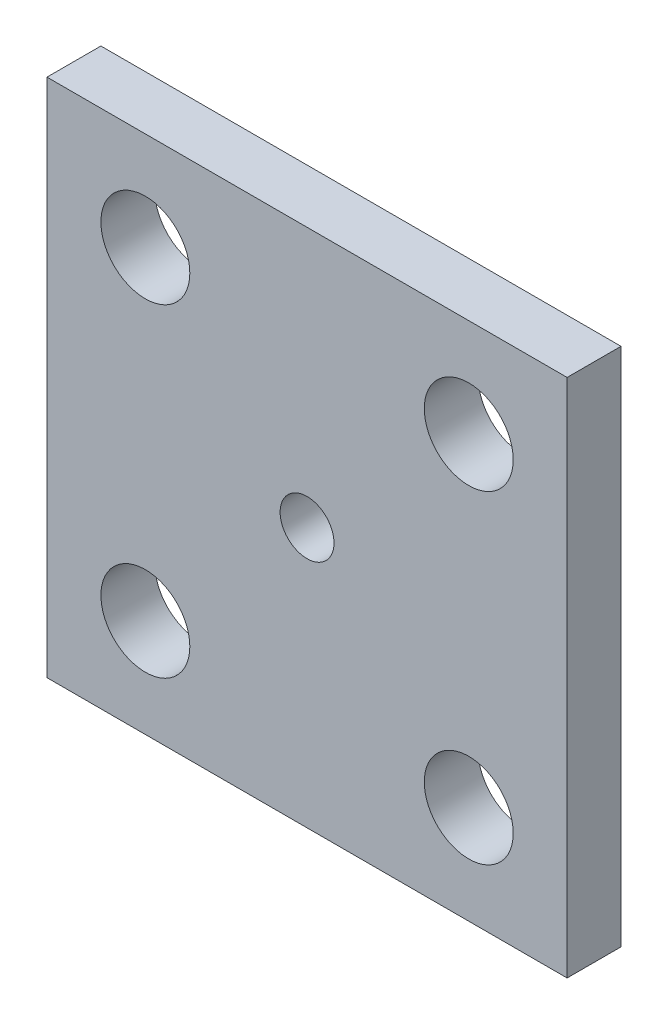
ISO-10303-21;
HEADER;
FILE_DESCRIPTION(('STEP AP214'),'2;1');
FILE_NAME('part.step','',(''),(''),'','','');
FILE_SCHEMA(('AUTOMOTIVE_DESIGN { 1 0 10303 214 1 1 1 1 }'));
ENDSEC;
DATA;
#1=APPLICATION_CONTEXT('core data for automotive mechanical design processes');
#2=APPLICATION_PROTOCOL_DEFINITION('international standard','automotive_design',2000,#1);
#3=PRODUCT_CONTEXT('',#1,'mechanical');
#4=PRODUCT('Part','Part','',(#3));
#5=PRODUCT_RELATED_PRODUCT_CATEGORY('part','',(#4));
#6=PRODUCT_DEFINITION_FORMATION('','',#4);
#7=PRODUCT_DEFINITION_CONTEXT('part definition',#1,'design');
#8=PRODUCT_DEFINITION('design','',#6,#7);
#9=PRODUCT_DEFINITION_SHAPE('','',#8);
#10=(LENGTH_UNIT() NAMED_UNIT(*) SI_UNIT(.MILLI.,.METRE.));
#11=(NAMED_UNIT(*) PLANE_ANGLE_UNIT() SI_UNIT($,.RADIAN.));
#12=(NAMED_UNIT(*) SI_UNIT($,.STERADIAN.) SOLID_ANGLE_UNIT());
#13=UNCERTAINTY_MEASURE_WITH_UNIT(LENGTH_MEASURE(1.E-05),#10,'distance_accuracy_value','');
#14=(GEOMETRIC_REPRESENTATION_CONTEXT(3) GLOBAL_UNCERTAINTY_ASSIGNED_CONTEXT((#13)) GLOBAL_UNIT_ASSIGNED_CONTEXT((#10,
#11,#12)) REPRESENTATION_CONTEXT('',''));
#15=CARTESIAN_POINT('',(0.,0.,0.));
#16=DIRECTION('',(0.,0.,1.));
#17=DIRECTION('',(1.,0.,0.));
#18=AXIS2_PLACEMENT_3D('',#15,#16,#17);
#19=CARTESIAN_POINT('',(0.,0.,5.));
#20=DIRECTION('',(0.,1.,0.));
#21=DIRECTION('',(0.,0.,1.));
#22=AXIS2_PLACEMENT_3D('',#19,#20,#21);
#23=PLANE('',#22);
#24=DIRECTION('',(1.,0.,0.));
#25=VECTOR('',#24,1.);
#26=CARTESIAN_POINT('',(0.,0.,0.));
#27=LINE('',#26,#25);
#28=CARTESIAN_POINT('',(0.,0.,0.));
#29=VERTEX_POINT('',#28);
#30=CARTESIAN_POINT('',(48.25,0.,0.));
#31=VERTEX_POINT('',#30);
#32=EDGE_CURVE('E117',#29,#31,#27,.T.);
#33=ORIENTED_EDGE('',*,*,#32,.T.);
#34=DIRECTION('',(0.,0.,-1.));
#35=VECTOR('',#34,1.);
#36=CARTESIAN_POINT('',(48.25,0.,5.));
#37=LINE('',#36,#35);
#38=CARTESIAN_POINT('',(48.25,0.,5.));
#39=VERTEX_POINT('',#38);
#40=EDGE_CURVE('E11',#39,#31,#37,.T.);
#41=ORIENTED_EDGE('',*,*,#40,.F.);
#42=DIRECTION('',(1.,0.,0.));
#43=VECTOR('',#42,1.);
#44=CARTESIAN_POINT('',(0.,0.,5.));
#45=LINE('',#44,#43);
#46=CARTESIAN_POINT('',(0.,0.,5.));
#47=VERTEX_POINT('',#46);
#48=EDGE_CURVE('E88',#47,#39,#45,.T.);
#49=ORIENTED_EDGE('',*,*,#48,.F.);
#50=DIRECTION('',(0.,0.,-1.));
#51=VECTOR('',#50,1.);
#52=CARTESIAN_POINT('',(0.,0.,5.));
#53=LINE('',#52,#51);
#54=EDGE_CURVE('E54',#47,#29,#53,.T.);
#55=ORIENTED_EDGE('',*,*,#54,.T.);
#56=EDGE_LOOP('',(#33,#41,#49,#55));
#57=FACE_BOUND('',#56,.T.);
#58=ADVANCED_FACE('F37',(#57),#23,.F.);
#59=CARTESIAN_POINT('',(48.25,0.,5.));
#60=DIRECTION('',(-1.,0.,0.));
#61=DIRECTION('',(0.,-1.,0.));
#62=AXIS2_PLACEMENT_3D('',#59,#60,#61);
#63=PLANE('',#62);
#64=DIRECTION('',(0.,1.,0.));
#65=VECTOR('',#64,1.);
#66=CARTESIAN_POINT('',(48.25,0.,0.));
#67=LINE('',#66,#65);
#68=CARTESIAN_POINT('',(48.25,48.25,0.));
#69=VERTEX_POINT('',#68);
#70=EDGE_CURVE('E93',#31,#69,#67,.T.);
#71=ORIENTED_EDGE('',*,*,#70,.T.);
#72=DIRECTION('',(0.,0.,-1.));
#73=VECTOR('',#72,1.);
#74=CARTESIAN_POINT('',(48.25,48.25,5.));
#75=LINE('',#74,#73);
#76=CARTESIAN_POINT('',(48.25,48.25,5.));
#77=VERTEX_POINT('',#76);
#78=EDGE_CURVE('E46',#77,#69,#75,.T.);
#79=ORIENTED_EDGE('',*,*,#78,.F.);
#80=DIRECTION('',(0.,1.,0.));
#81=VECTOR('',#80,1.);
#82=CARTESIAN_POINT('',(48.25,0.,5.));
#83=LINE('',#82,#81);
#84=EDGE_CURVE('E79',#39,#77,#83,.T.);
#85=ORIENTED_EDGE('',*,*,#84,.F.);
#86=ORIENTED_EDGE('',*,*,#40,.T.);
#87=EDGE_LOOP('',(#71,#79,#85,#86));
#88=FACE_BOUND('',#87,.T.);
#89=ADVANCED_FACE('F92',(#88),#63,.F.);
#90=CARTESIAN_POINT('',(0.,48.25,5.));
#91=DIRECTION('',(0.,1.,0.));
#92=DIRECTION('',(0.,0.,1.));
#93=AXIS2_PLACEMENT_3D('',#90,#91,#92);
#94=PLANE('',#93);
#95=DIRECTION('',(1.,0.,0.));
#96=VECTOR('',#95,1.);
#97=CARTESIAN_POINT('',(0.,48.25,0.));
#98=LINE('',#97,#96);
#99=CARTESIAN_POINT('',(0.,48.25,0.));
#100=VERTEX_POINT('',#99);
#101=EDGE_CURVE('E120',#100,#69,#98,.T.);
#102=ORIENTED_EDGE('',*,*,#101,.F.);
#103=DIRECTION('',(0.,0.,-1.));
#104=VECTOR('',#103,1.);
#105=CARTESIAN_POINT('',(0.,48.25,5.));
#106=LINE('',#105,#104);
#107=CARTESIAN_POINT('',(0.,48.25,5.));
#108=VERTEX_POINT('',#107);
#109=EDGE_CURVE('E68',#108,#100,#106,.T.);
#110=ORIENTED_EDGE('',*,*,#109,.F.);
#111=DIRECTION('',(1.,0.,0.));
#112=VECTOR('',#111,1.);
#113=CARTESIAN_POINT('',(0.,48.25,5.));
#114=LINE('',#113,#112);
#115=EDGE_CURVE('E87',#108,#77,#114,.T.);
#116=ORIENTED_EDGE('',*,*,#115,.T.);
#117=ORIENTED_EDGE('',*,*,#78,.T.);
#118=EDGE_LOOP('',(#102,#110,#116,#117));
#119=FACE_BOUND('',#118,.T.);
#120=ADVANCED_FACE('F96',(#119),#94,.T.);
#121=CARTESIAN_POINT('',(9.125,9.12500000000001,5.));
#122=DIRECTION('',(0.,0.,-1.));
#123=DIRECTION('',(-1.,0.,0.));
#124=AXIS2_PLACEMENT_3D('',#121,#122,#123);
#125=CYLINDRICAL_SURFACE('',#124,4.125);
#126=CARTESIAN_POINT('',(9.125,9.12500000000001,5.));
#127=DIRECTION('',(0.,0.,1.));
#128=DIRECTION('',(1.,0.,0.));
#129=AXIS2_PLACEMENT_3D('',#126,#127,#128);
#130=CIRCLE('',#129,4.125);
#131=CARTESIAN_POINT('',(13.25,9.12500000000001,5.));
#132=VERTEX_POINT('',#131);
#133=EDGE_CURVE('E105',#132,#132,#130,.T.);
#134=ORIENTED_EDGE('',*,*,#133,.T.);
#135=EDGE_LOOP('',(#134));
#136=FACE_BOUND('',#135,.T.);
#137=CARTESIAN_POINT('',(9.125,9.12500000000001,0.));
#138=DIRECTION('',(0.,0.,1.));
#139=DIRECTION('',(1.,0.,0.));
#140=AXIS2_PLACEMENT_3D('',#137,#138,#139);
#141=CIRCLE('',#140,4.125);
#142=CARTESIAN_POINT('',(13.25,9.12500000000001,0.));
#143=VERTEX_POINT('',#142);
#144=EDGE_CURVE('E128',#143,#143,#141,.T.);
#145=ORIENTED_EDGE('',*,*,#144,.F.);
#146=EDGE_LOOP('',(#145));
#147=FACE_BOUND('',#146,.T.);
#148=ADVANCED_FACE('F181',(#136,#147),#125,.F.);
#149=CARTESIAN_POINT('',(39.125,39.125,5.));
#150=DIRECTION('',(0.,0.,-1.));
#151=DIRECTION('',(-1.,0.,0.));
#152=AXIS2_PLACEMENT_3D('',#149,#150,#151);
#153=CYLINDRICAL_SURFACE('',#152,4.12499999999999);
#154=CARTESIAN_POINT('',(39.125,39.125,5.));
#155=DIRECTION('',(0.,0.,1.));
#156=DIRECTION('',(1.,0.,0.));
#157=AXIS2_PLACEMENT_3D('',#154,#155,#156);
#158=CIRCLE('',#157,4.12499999999999);
#159=CARTESIAN_POINT('',(43.25,39.125,5.));
#160=VERTEX_POINT('',#159);
#161=EDGE_CURVE('E99',#160,#160,#158,.T.);
#162=ORIENTED_EDGE('',*,*,#161,.T.);
#163=EDGE_LOOP('',(#162));
#164=FACE_BOUND('',#163,.T.);
#165=CARTESIAN_POINT('',(39.125,39.125,0.));
#166=DIRECTION('',(0.,0.,1.));
#167=DIRECTION('',(1.,0.,0.));
#168=AXIS2_PLACEMENT_3D('',#165,#166,#167);
#169=CIRCLE('',#168,4.12499999999999);
#170=CARTESIAN_POINT('',(43.25,39.125,0.));
#171=VERTEX_POINT('',#170);
#172=EDGE_CURVE('E125',#171,#171,#169,.T.);
#173=ORIENTED_EDGE('',*,*,#172,.F.);
#174=EDGE_LOOP('',(#173));
#175=FACE_BOUND('',#174,.T.);
#176=ADVANCED_FACE('F176',(#164,#175),#153,.F.);
#177=CARTESIAN_POINT('',(0.,0.,5.));
#178=DIRECTION('',(-1.,0.,0.));
#179=DIRECTION('',(0.,-1.,0.));
#180=AXIS2_PLACEMENT_3D('',#177,#178,#179);
#181=PLANE('',#180);
#182=DIRECTION('',(0.,1.,0.));
#183=VECTOR('',#182,1.);
#184=CARTESIAN_POINT('',(0.,0.,0.));
#185=LINE('',#184,#183);
#186=EDGE_CURVE('E122',#29,#100,#185,.T.);
#187=ORIENTED_EDGE('',*,*,#186,.F.);
#188=ORIENTED_EDGE('',*,*,#54,.F.);
#189=DIRECTION('',(0.,1.,0.));
#190=VECTOR('',#189,1.);
#191=CARTESIAN_POINT('',(0.,0.,5.));
#192=LINE('',#191,#190);
#193=EDGE_CURVE('E97',#47,#108,#192,.T.);
#194=ORIENTED_EDGE('',*,*,#193,.T.);
#195=ORIENTED_EDGE('',*,*,#109,.T.);
#196=EDGE_LOOP('',(#187,#188,#194,#195));
#197=FACE_BOUND('',#196,.T.);
#198=ADVANCED_FACE('F170',(#197),#181,.T.);
#199=CARTESIAN_POINT('',(24.125,24.125,5.));
#200=DIRECTION('',(0.,0.,-1.));
#201=DIRECTION('',(-1.,0.,0.));
#202=AXIS2_PLACEMENT_3D('',#199,#200,#201);
#203=CYLINDRICAL_SURFACE('',#202,2.5);
#204=CARTESIAN_POINT('',(24.125,24.125,5.));
#205=DIRECTION('',(0.,0.,1.));
#206=DIRECTION('',(1.,0.,0.));
#207=AXIS2_PLACEMENT_3D('',#204,#205,#206);
#208=CIRCLE('',#207,2.5);
#209=CARTESIAN_POINT('',(26.625,24.125,5.));
#210=VERTEX_POINT('',#209);
#211=EDGE_CURVE('E139',#210,#210,#208,.T.);
#212=ORIENTED_EDGE('',*,*,#211,.T.);
#213=EDGE_LOOP('',(#212));
#214=FACE_BOUND('',#213,.T.);
#215=CARTESIAN_POINT('',(24.125,24.125,0.));
#216=DIRECTION('',(0.,0.,1.));
#217=DIRECTION('',(1.,0.,0.));
#218=AXIS2_PLACEMENT_3D('',#215,#216,#217);
#219=CIRCLE('',#218,2.5);
#220=CARTESIAN_POINT('',(26.625,24.125,0.));
#221=VERTEX_POINT('',#220);
#222=EDGE_CURVE('E114',#221,#221,#219,.T.);
#223=ORIENTED_EDGE('',*,*,#222,.F.);
#224=EDGE_LOOP('',(#223));
#225=FACE_BOUND('',#224,.T.);
#226=ADVANCED_FACE('F147',(#214,#225),#203,.F.);
#227=CARTESIAN_POINT('',(9.125,39.125,5.));
#228=DIRECTION('',(0.,0.,-1.));
#229=DIRECTION('',(-1.,0.,0.));
#230=AXIS2_PLACEMENT_3D('',#227,#228,#229);
#231=CYLINDRICAL_SURFACE('',#230,4.125);
#232=CARTESIAN_POINT('',(9.125,39.125,5.));
#233=DIRECTION('',(0.,0.,1.));
#234=DIRECTION('',(1.,0.,0.));
#235=AXIS2_PLACEMENT_3D('',#232,#233,#234);
#236=CIRCLE('',#235,4.125);
#237=CARTESIAN_POINT('',(13.25,39.125,5.));
#238=VERTEX_POINT('',#237);
#239=EDGE_CURVE('E134',#238,#238,#236,.F.);
#240=ORIENTED_EDGE('',*,*,#239,.F.);
#241=EDGE_LOOP('',(#240));
#242=FACE_BOUND('',#241,.T.);
#243=CARTESIAN_POINT('',(9.125,39.125,0.));
#244=DIRECTION('',(0.,0.,1.));
#245=DIRECTION('',(1.,0.,0.));
#246=AXIS2_PLACEMENT_3D('',#243,#244,#245);
#247=CIRCLE('',#246,4.125);
#248=CARTESIAN_POINT('',(13.25,39.125,0.));
#249=VERTEX_POINT('',#248);
#250=EDGE_CURVE('E111',#249,#249,#247,.F.);
#251=ORIENTED_EDGE('',*,*,#250,.T.);
#252=EDGE_LOOP('',(#251));
#253=FACE_BOUND('',#252,.T.);
#254=ADVANCED_FACE('F39',(#242,#253),#231,.F.);
#255=CARTESIAN_POINT('',(39.125,9.12500000000001,5.));
#256=DIRECTION('',(0.,0.,-1.));
#257=DIRECTION('',(-1.,0.,0.));
#258=AXIS2_PLACEMENT_3D('',#255,#256,#257);
#259=CYLINDRICAL_SURFACE('',#258,4.12499999999998);
#260=CARTESIAN_POINT('',(39.125,9.12500000000001,5.));
#261=DIRECTION('',(0.,0.,1.));
#262=DIRECTION('',(1.,0.,0.));
#263=AXIS2_PLACEMENT_3D('',#260,#261,#262);
#264=CIRCLE('',#263,4.12499999999998);
#265=CARTESIAN_POINT('',(43.25,9.12500000000001,5.));
#266=VERTEX_POINT('',#265);
#267=EDGE_CURVE('E108',#266,#266,#264,.F.);
#268=ORIENTED_EDGE('',*,*,#267,.F.);
#269=EDGE_LOOP('',(#268));
#270=FACE_BOUND('',#269,.T.);
#271=CARTESIAN_POINT('',(39.125,9.12500000000001,0.));
#272=DIRECTION('',(0.,0.,1.));
#273=DIRECTION('',(1.,0.,0.));
#274=AXIS2_PLACEMENT_3D('',#271,#272,#273);
#275=CIRCLE('',#274,4.12499999999998);
#276=CARTESIAN_POINT('',(43.25,9.12500000000001,0.));
#277=VERTEX_POINT('',#276);
#278=EDGE_CURVE('E131',#277,#277,#275,.F.);
#279=ORIENTED_EDGE('',*,*,#278,.T.);
#280=EDGE_LOOP('',(#279));
#281=FACE_BOUND('',#280,.T.);
#282=ADVANCED_FACE('F152',(#270,#281),#259,.F.);
#283=CARTESIAN_POINT('',(0.,0.,5.));
#284=DIRECTION('',(0.,0.,1.));
#285=DIRECTION('',(1.,0.,0.));
#286=AXIS2_PLACEMENT_3D('',#283,#284,#285);
#287=PLANE('',#286);
#288=ORIENTED_EDGE('',*,*,#239,.T.);
#289=EDGE_LOOP('',(#288));
#290=FACE_BOUND('',#289,.T.);
#291=ORIENTED_EDGE('',*,*,#211,.F.);
#292=EDGE_LOOP('',(#291));
#293=FACE_BOUND('',#292,.T.);
#294=ORIENTED_EDGE('',*,*,#48,.T.);
#295=ORIENTED_EDGE('',*,*,#84,.T.);
#296=ORIENTED_EDGE('',*,*,#115,.F.);
#297=ORIENTED_EDGE('',*,*,#193,.F.);
#298=EDGE_LOOP('',(#294,#295,#296,#297));
#299=FACE_BOUND('',#298,.T.);
#300=ORIENTED_EDGE('',*,*,#161,.F.);
#301=EDGE_LOOP('',(#300));
#302=FACE_BOUND('',#301,.T.);
#303=ORIENTED_EDGE('',*,*,#133,.F.);
#304=EDGE_LOOP('',(#303));
#305=FACE_BOUND('',#304,.T.);
#306=ORIENTED_EDGE('',*,*,#267,.T.);
#307=EDGE_LOOP('',(#306));
#308=FACE_BOUND('',#307,.T.);
#309=ADVANCED_FACE('F83',(#290,#293,#299,#302,#305,#308),#287,.T.);
#310=CARTESIAN_POINT('',(0.,0.,0.));
#311=DIRECTION('',(0.,0.,1.));
#312=DIRECTION('',(1.,0.,0.));
#313=AXIS2_PLACEMENT_3D('',#310,#311,#312);
#314=PLANE('',#313);
#315=ORIENTED_EDGE('',*,*,#250,.F.);
#316=EDGE_LOOP('',(#315));
#317=FACE_BOUND('',#316,.T.);
#318=ORIENTED_EDGE('',*,*,#222,.T.);
#319=EDGE_LOOP('',(#318));
#320=FACE_BOUND('',#319,.T.);
#321=ORIENTED_EDGE('',*,*,#32,.F.);
#322=ORIENTED_EDGE('',*,*,#186,.T.);
#323=ORIENTED_EDGE('',*,*,#101,.T.);
#324=ORIENTED_EDGE('',*,*,#70,.F.);
#325=EDGE_LOOP('',(#321,#322,#323,#324));
#326=FACE_BOUND('',#325,.T.);
#327=ORIENTED_EDGE('',*,*,#172,.T.);
#328=EDGE_LOOP('',(#327));
#329=FACE_BOUND('',#328,.T.);
#330=ORIENTED_EDGE('',*,*,#144,.T.);
#331=EDGE_LOOP('',(#330));
#332=FACE_BOUND('',#331,.T.);
#333=ORIENTED_EDGE('',*,*,#278,.F.);
#334=EDGE_LOOP('',(#333));
#335=FACE_BOUND('',#334,.T.);
#336=ADVANCED_FACE('F151',(#317,#320,#326,#329,#332,#335),#314,.F.);
#337=CLOSED_SHELL('',(#58,#89,#120,#148,#176,#198,#226,#254,#282,#309,#336));
#338=MANIFOLD_SOLID_BREP('B2',#337);
#339=ADVANCED_BREP_SHAPE_REPRESENTATION('',(#18,#338),#14);
#340=SHAPE_DEFINITION_REPRESENTATION(#9,#339);
ENDSEC;
END-ISO-10303-21;
